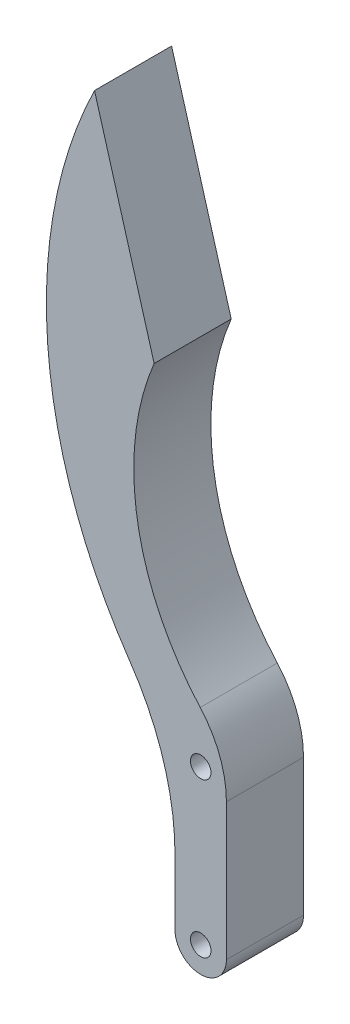
ISO-10303-21;
HEADER;
FILE_DESCRIPTION(('STEP AP214'),'2;1');
FILE_NAME('part.step','',(''),(''),'','','');
FILE_SCHEMA(('AUTOMOTIVE_DESIGN { 1 0 10303 214 1 1 1 1 }'));
ENDSEC;
DATA;
#1=APPLICATION_CONTEXT('core data for automotive mechanical design processes');
#2=APPLICATION_PROTOCOL_DEFINITION('international standard','automotive_design',2000,#1);
#3=PRODUCT_CONTEXT('',#1,'mechanical');
#4=PRODUCT('Part','Part','',(#3));
#5=PRODUCT_RELATED_PRODUCT_CATEGORY('part','',(#4));
#6=PRODUCT_DEFINITION_FORMATION('','',#4);
#7=PRODUCT_DEFINITION_CONTEXT('part definition',#1,'design');
#8=PRODUCT_DEFINITION('design','',#6,#7);
#9=PRODUCT_DEFINITION_SHAPE('','',#8);
#10=(LENGTH_UNIT() NAMED_UNIT(*) SI_UNIT(.MILLI.,.METRE.));
#11=(NAMED_UNIT(*) PLANE_ANGLE_UNIT() SI_UNIT($,.RADIAN.));
#12=(NAMED_UNIT(*) SI_UNIT($,.STERADIAN.) SOLID_ANGLE_UNIT());
#13=UNCERTAINTY_MEASURE_WITH_UNIT(LENGTH_MEASURE(1.E-05),#10,'distance_accuracy_value','');
#14=(GEOMETRIC_REPRESENTATION_CONTEXT(3) GLOBAL_UNCERTAINTY_ASSIGNED_CONTEXT((#13)) GLOBAL_UNIT_ASSIGNED_CONTEXT((#10,
#11,#12)) REPRESENTATION_CONTEXT('',''));
#15=CARTESIAN_POINT('',(0.,0.,0.));
#16=DIRECTION('',(0.,0.,1.));
#17=DIRECTION('',(1.,0.,0.));
#18=AXIS2_PLACEMENT_3D('',#15,#16,#17);
#19=CARTESIAN_POINT('',(22.4774409912687,6.4878889380961,15.));
#20=DIRECTION('',(-0.960777913191278,-0.277318952694931,0.));
#21=DIRECTION('',(0.277318952694931,-0.960777913191278,0.));
#22=AXIS2_PLACEMENT_3D('',#19,#20,#21);
#23=PLANE('',#22);
#24=DIRECTION('',(-0.277318952694931,0.960777913191278,0.));
#25=VECTOR('',#24,1.);
#26=CARTESIAN_POINT('',(22.4774409912687,6.4878889380961,0.));
#27=LINE('',#26,#25);
#28=CARTESIAN_POINT('',(-4.06283351523772,98.4372826167019,0.));
#29=VERTEX_POINT('',#28);
#30=CARTESIAN_POINT('',(-15.6667371675758,138.639274682605,0.));
#31=VERTEX_POINT('',#30);
#32=EDGE_CURVE('E127',#29,#31,#27,.T.);
#33=ORIENTED_EDGE('',*,*,#32,.T.);
#34=DIRECTION('',(0.,0.,-1.));
#35=VECTOR('',#34,1.);
#36=CARTESIAN_POINT('',(-15.6667371675758,138.639274682605,15.));
#37=LINE('',#36,#35);
#38=CARTESIAN_POINT('',(-15.6667371675758,138.639274682605,15.));
#39=VERTEX_POINT('',#38);
#40=EDGE_CURVE('E111',#39,#31,#37,.T.);
#41=ORIENTED_EDGE('',*,*,#40,.F.);
#42=DIRECTION('',(-0.277318952694931,0.960777913191278,0.));
#43=VECTOR('',#42,1.);
#44=CARTESIAN_POINT('',(22.4774409912687,6.4878889380961,15.));
#45=LINE('',#44,#43);
#46=CARTESIAN_POINT('',(-4.06283351523772,98.4372826167019,15.));
#47=VERTEX_POINT('',#46);
#48=EDGE_CURVE('E116',#47,#39,#45,.T.);
#49=ORIENTED_EDGE('',*,*,#48,.F.);
#50=DIRECTION('',(0.,0.,-1.));
#51=VECTOR('',#50,1.);
#52=CARTESIAN_POINT('',(-4.06283351523772,98.4372826167019,15.));
#53=LINE('',#52,#51);
#54=EDGE_CURVE('E129',#47,#29,#53,.T.);
#55=ORIENTED_EDGE('',*,*,#54,.T.);
#56=EDGE_LOOP('',(#33,#41,#49,#55));
#57=FACE_BOUND('',#56,.T.);
#58=ADVANCED_FACE('F40',(#57),#23,.F.);
#59=CARTESIAN_POINT('',(67.1584116734309,98.1558466559324,15.));
#60=DIRECTION('',(0.,0.,-1.));
#61=DIRECTION('',(-1.,0.,0.));
#62=AXIS2_PLACEMENT_3D('',#59,#60,#61);
#63=CYLINDRICAL_SURFACE('',#62,92.1895505213344);
#64=CARTESIAN_POINT('',(67.1584116734309,98.1558466559324,0.));
#65=DIRECTION('',(0.,0.,1.));
#66=DIRECTION('',(1.,0.,0.));
#67=AXIS2_PLACEMENT_3D('',#64,#65,#66);
#68=CIRCLE('',#67,92.1895505213344);
#69=CARTESIAN_POINT('',(-8.80203177945478,45.9167400808135,0.));
#70=VERTEX_POINT('',#69);
#71=EDGE_CURVE('E175',#31,#70,#68,.T.);
#72=ORIENTED_EDGE('',*,*,#71,.T.);
#73=DIRECTION('',(0.,0.,-1.));
#74=VECTOR('',#73,1.);
#75=CARTESIAN_POINT('',(-8.80203177945478,45.9167400808135,15.));
#76=LINE('',#75,#74);
#77=CARTESIAN_POINT('',(-8.80203177945478,45.9167400808135,15.));
#78=VERTEX_POINT('',#77);
#79=EDGE_CURVE('E55',#70,#78,#76,.F.);
#80=ORIENTED_EDGE('',*,*,#79,.T.);
#81=CARTESIAN_POINT('',(67.1584116734309,98.1558466559324,15.));
#82=DIRECTION('',(0.,0.,1.));
#83=DIRECTION('',(1.,0.,0.));
#84=AXIS2_PLACEMENT_3D('',#81,#82,#83);
#85=CIRCLE('',#84,92.1895505213344);
#86=EDGE_CURVE('E107',#39,#78,#85,.T.);
#87=ORIENTED_EDGE('',*,*,#86,.F.);
#88=ORIENTED_EDGE('',*,*,#40,.T.);
#89=EDGE_LOOP('',(#72,#80,#87,#88));
#90=FACE_BOUND('',#89,.T.);
#91=ADVANCED_FACE('F109',(#90),#63,.T.);
#92=CARTESIAN_POINT('',(0.,0.,15.));
#93=DIRECTION('',(1.,0.,0.));
#94=DIRECTION('',(0.,0.,-1.));
#95=AXIS2_PLACEMENT_3D('',#92,#93,#94);
#96=PLANE('',#95);
#97=DIRECTION('',(0.,-1.,0.));
#98=VECTOR('',#97,1.);
#99=CARTESIAN_POINT('',(0.,0.,15.));
#100=LINE('',#99,#98);
#101=CARTESIAN_POINT('',(0.,17.5842955251641,15.));
#102=VERTEX_POINT('',#101);
#103=CARTESIAN_POINT('',(0.,5.,15.));
#104=VERTEX_POINT('',#103);
#105=EDGE_CURVE('E115',#102,#104,#100,.T.);
#106=ORIENTED_EDGE('',*,*,#105,.F.);
#107=DIRECTION('',(0.,0.,1.));
#108=VECTOR('',#107,1.);
#109=CARTESIAN_POINT('',(0.,17.5842955251641,0.));
#110=LINE('',#109,#108);
#111=CARTESIAN_POINT('',(0.,17.5842955251641,0.));
#112=VERTEX_POINT('',#111);
#113=EDGE_CURVE('E158',#102,#112,#110,.F.);
#114=ORIENTED_EDGE('',*,*,#113,.T.);
#115=DIRECTION('',(0.,-1.,0.));
#116=VECTOR('',#115,1.);
#117=CARTESIAN_POINT('',(0.,0.,0.));
#118=LINE('',#117,#116);
#119=CARTESIAN_POINT('',(0.,5.,0.));
#120=VERTEX_POINT('',#119);
#121=EDGE_CURVE('E169',#112,#120,#118,.T.);
#122=ORIENTED_EDGE('',*,*,#121,.T.);
#123=DIRECTION('',(0.,0.,-1.));
#124=VECTOR('',#123,1.);
#125=CARTESIAN_POINT('',(0.,5.,15.));
#126=LINE('',#125,#124);
#127=EDGE_CURVE('E149',#120,#104,#126,.F.);
#128=ORIENTED_EDGE('',*,*,#127,.T.);
#129=EDGE_LOOP('',(#106,#114,#122,#128));
#130=FACE_BOUND('',#129,.T.);
#131=ADVANCED_FACE('F168',(#130),#96,.F.);
#132=CARTESIAN_POINT('',(10.,0.,15.));
#133=DIRECTION('',(-1.,0.,0.));
#134=DIRECTION('',(0.,0.,1.));
#135=AXIS2_PLACEMENT_3D('',#132,#133,#134);
#136=PLANE('',#135);
#137=DIRECTION('',(0.,1.,0.));
#138=VECTOR('',#137,1.);
#139=CARTESIAN_POINT('',(10.,0.,15.));
#140=LINE('',#139,#138);
#141=CARTESIAN_POINT('',(10.,5.,15.));
#142=VERTEX_POINT('',#141);
#143=CARTESIAN_POINT('',(10.,31.6108350127959,15.));
#144=VERTEX_POINT('',#143);
#145=EDGE_CURVE('E192',#142,#144,#140,.T.);
#146=ORIENTED_EDGE('',*,*,#145,.F.);
#147=DIRECTION('',(0.,0.,-1.));
#148=VECTOR('',#147,1.);
#149=CARTESIAN_POINT('',(10.,5.,15.));
#150=LINE('',#149,#148);
#151=CARTESIAN_POINT('',(10.,5.,0.));
#152=VERTEX_POINT('',#151);
#153=EDGE_CURVE('E156',#142,#152,#150,.T.);
#154=ORIENTED_EDGE('',*,*,#153,.T.);
#155=DIRECTION('',(0.,1.,0.));
#156=VECTOR('',#155,1.);
#157=CARTESIAN_POINT('',(10.,0.,0.));
#158=LINE('',#157,#156);
#159=CARTESIAN_POINT('',(10.,31.6108350127959,0.));
#160=VERTEX_POINT('',#159);
#161=EDGE_CURVE('E174',#152,#160,#158,.T.);
#162=ORIENTED_EDGE('',*,*,#161,.T.);
#163=DIRECTION('',(0.,0.,1.));
#164=VECTOR('',#163,1.);
#165=CARTESIAN_POINT('',(10.,31.6108350127959,15.));
#166=LINE('',#165,#164);
#167=EDGE_CURVE('E139',#160,#144,#166,.T.);
#168=ORIENTED_EDGE('',*,*,#167,.T.);
#169=EDGE_LOOP('',(#146,#154,#162,#168));
#170=FACE_BOUND('',#169,.T.);
#171=ADVANCED_FACE('F205',(#170),#136,.F.);
#172=CARTESIAN_POINT('',(5.,35.,15.));
#173=DIRECTION('',(0.,0.,-1.));
#174=DIRECTION('',(-1.,0.,0.));
#175=AXIS2_PLACEMENT_3D('',#172,#173,#174);
#176=CYLINDRICAL_SURFACE('',#175,2.);
#177=CARTESIAN_POINT('',(5.,35.,15.));
#178=DIRECTION('',(0.,0.,1.));
#179=DIRECTION('',(1.,0.,0.));
#180=AXIS2_PLACEMENT_3D('',#177,#178,#179);
#181=CIRCLE('',#180,2.);
#182=CARTESIAN_POINT('',(7.,35.,15.));
#183=VERTEX_POINT('',#182);
#184=EDGE_CURVE('E124',#183,#183,#181,.T.);
#185=ORIENTED_EDGE('',*,*,#184,.T.);
#186=EDGE_LOOP('',(#185));
#187=FACE_BOUND('',#186,.T.);
#188=CARTESIAN_POINT('',(5.,35.,0.));
#189=DIRECTION('',(0.,0.,1.));
#190=DIRECTION('',(1.,0.,0.));
#191=AXIS2_PLACEMENT_3D('',#188,#189,#190);
#192=CIRCLE('',#191,2.);
#193=CARTESIAN_POINT('',(7.,35.,0.));
#194=VERTEX_POINT('',#193);
#195=EDGE_CURVE('E197',#194,#194,#192,.T.);
#196=ORIENTED_EDGE('',*,*,#195,.F.);
#197=EDGE_LOOP('',(#196));
#198=FACE_BOUND('',#197,.T.);
#199=ADVANCED_FACE('F202',(#187,#198),#176,.F.);
#200=CARTESIAN_POINT('',(5.,5.,15.));
#201=DIRECTION('',(0.,0.,-1.));
#202=DIRECTION('',(-1.,0.,0.));
#203=AXIS2_PLACEMENT_3D('',#200,#201,#202);
#204=CYLINDRICAL_SURFACE('',#203,2.);
#205=CARTESIAN_POINT('',(5.,5.,15.));
#206=DIRECTION('',(0.,0.,1.));
#207=DIRECTION('',(1.,0.,0.));
#208=AXIS2_PLACEMENT_3D('',#205,#206,#207);
#209=CIRCLE('',#208,2.);
#210=CARTESIAN_POINT('',(7.,5.,15.));
#211=VERTEX_POINT('',#210);
#212=EDGE_CURVE('E182',#211,#211,#209,.T.);
#213=ORIENTED_EDGE('',*,*,#212,.T.);
#214=EDGE_LOOP('',(#213));
#215=FACE_BOUND('',#214,.T.);
#216=CARTESIAN_POINT('',(5.,5.,0.));
#217=DIRECTION('',(0.,0.,1.));
#218=DIRECTION('',(1.,0.,0.));
#219=AXIS2_PLACEMENT_3D('',#216,#217,#218);
#220=CIRCLE('',#219,2.);
#221=CARTESIAN_POINT('',(7.,5.,0.));
#222=VERTEX_POINT('',#221);
#223=EDGE_CURVE('E162',#222,#222,#220,.T.);
#224=ORIENTED_EDGE('',*,*,#223,.F.);
#225=EDGE_LOOP('',(#224));
#226=FACE_BOUND('',#225,.T.);
#227=ADVANCED_FACE('F204',(#215,#226),#204,.F.);
#228=CARTESIAN_POINT('',(42.7016229068822,78.7803302992849,15.));
#229=DIRECTION('',(0.,0.,-1.));
#230=DIRECTION('',(-1.,0.,0.));
#231=AXIS2_PLACEMENT_3D('',#228,#229,#230);
#232=CYLINDRICAL_SURFACE('',#231,50.7278045933939);
#233=CARTESIAN_POINT('',(42.7016229068822,78.7803302992849,15.));
#234=DIRECTION('',(0.,0.,1.));
#235=DIRECTION('',(1.,0.,0.));
#236=AXIS2_PLACEMENT_3D('',#233,#234,#235);
#237=CIRCLE('',#236,50.7278045933939);
#238=CARTESIAN_POINT('',(4.90266047698153,44.9491523994761,15.));
#239=VERTEX_POINT('',#238);
#240=EDGE_CURVE('E122',#47,#239,#237,.T.);
#241=ORIENTED_EDGE('',*,*,#240,.T.);
#242=DIRECTION('',(0.,0.,-1.));
#243=VECTOR('',#242,1.);
#244=CARTESIAN_POINT('',(4.90266047698153,44.9491523994761,15.));
#245=LINE('',#244,#243);
#246=CARTESIAN_POINT('',(4.90266047698153,44.9491523994761,0.));
#247=VERTEX_POINT('',#246);
#248=EDGE_CURVE('E128',#239,#247,#245,.T.);
#249=ORIENTED_EDGE('',*,*,#248,.T.);
#250=CARTESIAN_POINT('',(42.7016229068822,78.7803302992849,0.));
#251=DIRECTION('',(0.,0.,1.));
#252=DIRECTION('',(1.,0.,0.));
#253=AXIS2_PLACEMENT_3D('',#250,#251,#252);
#254=CIRCLE('',#253,50.7278045933939);
#255=EDGE_CURVE('E177',#29,#247,#254,.T.);
#256=ORIENTED_EDGE('',*,*,#255,.F.);
#257=ORIENTED_EDGE('',*,*,#54,.F.);
#258=EDGE_LOOP('',(#241,#249,#256,#257));
#259=FACE_BOUND('',#258,.T.);
#260=ADVANCED_FACE('F212',(#259),#232,.F.);
#261=CARTESIAN_POINT('',(0.,0.,15.));
#262=DIRECTION('',(0.,0.,1.));
#263=DIRECTION('',(1.,0.,0.));
#264=AXIS2_PLACEMENT_3D('',#261,#262,#263);
#265=PLANE('',#264);
#266=ORIENTED_EDGE('',*,*,#212,.F.);
#267=EDGE_LOOP('',(#266));
#268=FACE_BOUND('',#267,.T.);
#269=ORIENTED_EDGE('',*,*,#184,.F.);
#270=EDGE_LOOP('',(#269));
#271=FACE_BOUND('',#270,.T.);
#272=ORIENTED_EDGE('',*,*,#86,.T.);
#273=CARTESIAN_POINT('',(-50.,17.5842955251641,15.));
#274=DIRECTION('',(0.,0.,1.));
#275=DIRECTION('',(1.,0.,0.));
#276=AXIS2_PLACEMENT_3D('',#273,#274,#275);
#277=CIRCLE('',#276,50.);
#278=EDGE_CURVE('E11',#78,#102,#277,.F.);
#279=ORIENTED_EDGE('',*,*,#278,.T.);
#280=ORIENTED_EDGE('',*,*,#105,.T.);
#281=CARTESIAN_POINT('',(5.,5.,15.));
#282=DIRECTION('',(0.,0.,1.));
#283=DIRECTION('',(1.,0.,0.));
#284=AXIS2_PLACEMENT_3D('',#281,#282,#283);
#285=CIRCLE('',#284,5.);
#286=CARTESIAN_POINT('',(5.,0.,15.));
#287=VERTEX_POINT('',#286);
#288=EDGE_CURVE('E154',#104,#287,#285,.T.);
#289=ORIENTED_EDGE('',*,*,#288,.T.);
#290=CARTESIAN_POINT('',(5.,5.,15.));
#291=DIRECTION('',(0.,0.,1.));
#292=DIRECTION('',(1.,0.,0.));
#293=AXIS2_PLACEMENT_3D('',#290,#291,#292);
#294=CIRCLE('',#293,5.);
#295=EDGE_CURVE('E152',#287,#142,#294,.T.);
#296=ORIENTED_EDGE('',*,*,#295,.T.);
#297=ORIENTED_EDGE('',*,*,#145,.T.);
#298=CARTESIAN_POINT('',(-9.99999999999999,31.6108350127959,15.));
#299=DIRECTION('',(0.,0.,1.));
#300=DIRECTION('',(1.,0.,0.));
#301=AXIS2_PLACEMENT_3D('',#298,#299,#300);
#302=CIRCLE('',#301,20.);
#303=EDGE_CURVE('E142',#144,#239,#302,.T.);
#304=ORIENTED_EDGE('',*,*,#303,.T.);
#305=ORIENTED_EDGE('',*,*,#240,.F.);
#306=ORIENTED_EDGE('',*,*,#48,.T.);
#307=EDGE_LOOP('',(#272,#279,#280,#289,#296,#297,#304,#305,#306));
#308=FACE_BOUND('',#307,.T.);
#309=ADVANCED_FACE('F120',(#268,#271,#308),#265,.T.);
#310=CARTESIAN_POINT('',(0.,0.,0.));
#311=DIRECTION('',(0.,0.,1.));
#312=DIRECTION('',(1.,0.,0.));
#313=AXIS2_PLACEMENT_3D('',#310,#311,#312);
#314=PLANE('',#313);
#315=ORIENTED_EDGE('',*,*,#223,.T.);
#316=EDGE_LOOP('',(#315));
#317=FACE_BOUND('',#316,.T.);
#318=ORIENTED_EDGE('',*,*,#195,.T.);
#319=EDGE_LOOP('',(#318));
#320=FACE_BOUND('',#319,.T.);
#321=CARTESIAN_POINT('',(5.,5.,0.));
#322=DIRECTION('',(0.,0.,1.));
#323=DIRECTION('',(1.,0.,0.));
#324=AXIS2_PLACEMENT_3D('',#321,#322,#323);
#325=CIRCLE('',#324,5.);
#326=CARTESIAN_POINT('',(5.,0.,0.));
#327=VERTEX_POINT('',#326);
#328=EDGE_CURVE('E144',#152,#327,#325,.F.);
#329=ORIENTED_EDGE('',*,*,#328,.T.);
#330=CARTESIAN_POINT('',(5.,5.,0.));
#331=DIRECTION('',(0.,0.,1.));
#332=DIRECTION('',(1.,0.,0.));
#333=AXIS2_PLACEMENT_3D('',#330,#331,#332);
#334=CIRCLE('',#333,5.);
#335=EDGE_CURVE('E146',#327,#120,#334,.F.);
#336=ORIENTED_EDGE('',*,*,#335,.T.);
#337=ORIENTED_EDGE('',*,*,#121,.F.);
#338=CARTESIAN_POINT('',(-50.,17.5842955251641,0.));
#339=DIRECTION('',(0.,0.,1.));
#340=DIRECTION('',(1.,0.,0.));
#341=AXIS2_PLACEMENT_3D('',#338,#339,#340);
#342=CIRCLE('',#341,50.);
#343=EDGE_CURVE('E48',#112,#70,#342,.T.);
#344=ORIENTED_EDGE('',*,*,#343,.T.);
#345=ORIENTED_EDGE('',*,*,#71,.F.);
#346=ORIENTED_EDGE('',*,*,#32,.F.);
#347=ORIENTED_EDGE('',*,*,#255,.T.);
#348=CARTESIAN_POINT('',(-9.99999999999999,31.6108350127959,0.));
#349=DIRECTION('',(0.,0.,1.));
#350=DIRECTION('',(1.,0.,0.));
#351=AXIS2_PLACEMENT_3D('',#348,#349,#350);
#352=CIRCLE('',#351,20.);
#353=EDGE_CURVE('E132',#247,#160,#352,.F.);
#354=ORIENTED_EDGE('',*,*,#353,.T.);
#355=ORIENTED_EDGE('',*,*,#161,.F.);
#356=EDGE_LOOP('',(#329,#336,#337,#344,#345,#346,#347,#354,#355));
#357=FACE_BOUND('',#356,.T.);
#358=ADVANCED_FACE('F171',(#317,#320,#357),#314,.F.);
#359=CARTESIAN_POINT('',(-9.99999999999999,31.6108350127959,15.));
#360=DIRECTION('',(0.,0.,-1.));
#361=DIRECTION('',(-1.,0.,0.));
#362=AXIS2_PLACEMENT_3D('',#359,#360,#361);
#363=CYLINDRICAL_SURFACE('',#362,20.);
#364=ORIENTED_EDGE('',*,*,#303,.F.);
#365=ORIENTED_EDGE('',*,*,#167,.F.);
#366=ORIENTED_EDGE('',*,*,#353,.F.);
#367=ORIENTED_EDGE('',*,*,#248,.F.);
#368=EDGE_LOOP('',(#364,#365,#366,#367));
#369=FACE_BOUND('',#368,.T.);
#370=ADVANCED_FACE('F230',(#369),#363,.T.);
#371=CARTESIAN_POINT('',(5.,5.,15.));
#372=DIRECTION('',(0.,0.,-1.));
#373=DIRECTION('',(-1.,0.,0.));
#374=AXIS2_PLACEMENT_3D('',#371,#372,#373);
#375=CYLINDRICAL_SURFACE('',#374,5.);
#376=ORIENTED_EDGE('',*,*,#153,.F.);
#377=ORIENTED_EDGE('',*,*,#295,.F.);
#378=DIRECTION('',(0.,0.,-1.));
#379=VECTOR('',#378,1.);
#380=CARTESIAN_POINT('',(5.,0.,15.));
#381=LINE('',#380,#379);
#382=EDGE_CURVE('E159',#327,#287,#381,.F.);
#383=ORIENTED_EDGE('',*,*,#382,.F.);
#384=ORIENTED_EDGE('',*,*,#328,.F.);
#385=EDGE_LOOP('',(#376,#377,#383,#384));
#386=FACE_BOUND('',#385,.T.);
#387=ADVANCED_FACE('F251',(#386),#375,.T.);
#388=CARTESIAN_POINT('',(5.,5.,15.));
#389=DIRECTION('',(0.,0.,-1.));
#390=DIRECTION('',(-1.,0.,0.));
#391=AXIS2_PLACEMENT_3D('',#388,#389,#390);
#392=CYLINDRICAL_SURFACE('',#391,5.);
#393=ORIENTED_EDGE('',*,*,#288,.F.);
#394=ORIENTED_EDGE('',*,*,#127,.F.);
#395=ORIENTED_EDGE('',*,*,#335,.F.);
#396=ORIENTED_EDGE('',*,*,#382,.T.);
#397=EDGE_LOOP('',(#393,#394,#395,#396));
#398=FACE_BOUND('',#397,.T.);
#399=ADVANCED_FACE('F260',(#398),#392,.T.);
#400=CARTESIAN_POINT('',(-50.,17.5842955251641,15.));
#401=DIRECTION('',(0.,0.,-1.));
#402=DIRECTION('',(-1.,0.,0.));
#403=AXIS2_PLACEMENT_3D('',#400,#401,#402);
#404=CYLINDRICAL_SURFACE('',#403,50.);
#405=ORIENTED_EDGE('',*,*,#278,.F.);
#406=ORIENTED_EDGE('',*,*,#79,.F.);
#407=ORIENTED_EDGE('',*,*,#343,.F.);
#408=ORIENTED_EDGE('',*,*,#113,.F.);
#409=EDGE_LOOP('',(#405,#406,#407,#408));
#410=FACE_BOUND('',#409,.T.);
#411=ADVANCED_FACE('F42',(#410),#404,.F.);
#412=CLOSED_SHELL('',(#58,#91,#131,#171,#199,#227,#260,#309,#358,#370,#387,#399,#411));
#413=MANIFOLD_SOLID_BREP('B2',#412);
#414=ADVANCED_BREP_SHAPE_REPRESENTATION('',(#18,#413),#14);
#415=SHAPE_DEFINITION_REPRESENTATION(#9,#414);
ENDSEC;
END-ISO-10303-21;
